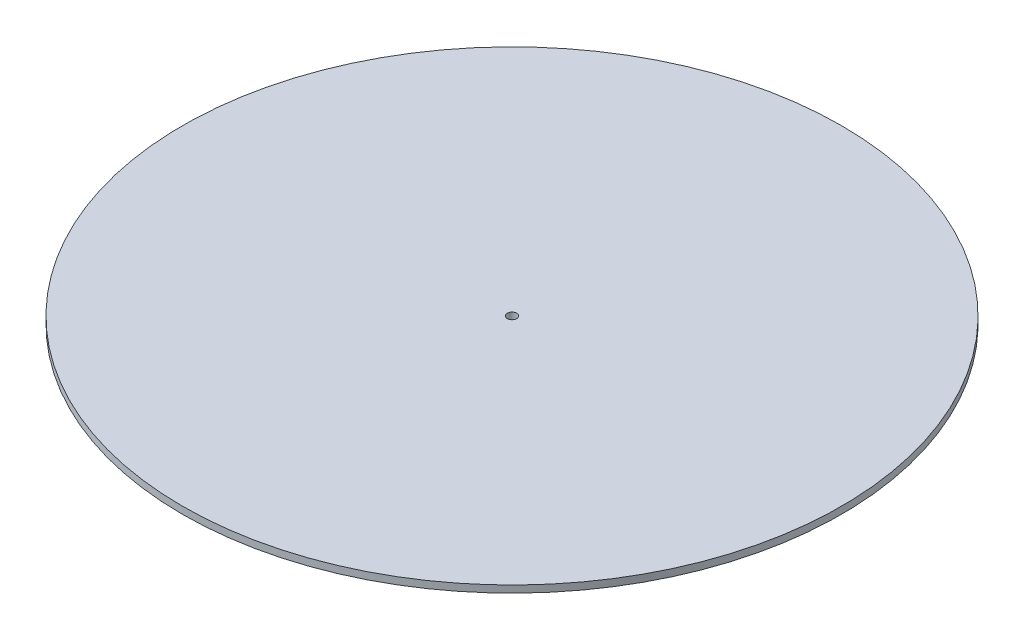
ISO-10303-21;
HEADER;
FILE_DESCRIPTION(('STEP AP214'),'2;1');
FILE_NAME('part.step','',(''),(''),'','','');
FILE_SCHEMA(('AUTOMOTIVE_DESIGN { 1 0 10303 214 1 1 1 1 }'));
ENDSEC;
DATA;
#1=APPLICATION_CONTEXT('core data for automotive mechanical design processes');
#2=APPLICATION_PROTOCOL_DEFINITION('international standard','automotive_design',2000,#1);
#3=PRODUCT_CONTEXT('',#1,'mechanical');
#4=PRODUCT('Part','Part','',(#3));
#5=PRODUCT_RELATED_PRODUCT_CATEGORY('part','',(#4));
#6=PRODUCT_DEFINITION_FORMATION('','',#4);
#7=PRODUCT_DEFINITION_CONTEXT('part definition',#1,'design');
#8=PRODUCT_DEFINITION('design','',#6,#7);
#9=PRODUCT_DEFINITION_SHAPE('','',#8);
#10=(LENGTH_UNIT() NAMED_UNIT(*) SI_UNIT(.MILLI.,.METRE.));
#11=(NAMED_UNIT(*) PLANE_ANGLE_UNIT() SI_UNIT($,.RADIAN.));
#12=(NAMED_UNIT(*) SI_UNIT($,.STERADIAN.) SOLID_ANGLE_UNIT());
#13=UNCERTAINTY_MEASURE_WITH_UNIT(LENGTH_MEASURE(1.E-05),#10,'distance_accuracy_value','');
#14=(GEOMETRIC_REPRESENTATION_CONTEXT(3) GLOBAL_UNCERTAINTY_ASSIGNED_CONTEXT((#13)) GLOBAL_UNIT_ASSIGNED_CONTEXT((#10,
#11,#12)) REPRESENTATION_CONTEXT('',''));
#15=CARTESIAN_POINT('',(0.,0.,0.));
#16=DIRECTION('',(0.,0.,1.));
#17=DIRECTION('',(1.,0.,0.));
#18=AXIS2_PLACEMENT_3D('',#15,#16,#17);
#19=CARTESIAN_POINT('',(0.,3.,0.));
#20=DIRECTION('',(0.,1.,0.));
#21=DIRECTION('',(0.,0.,1.));
#22=AXIS2_PLACEMENT_3D('',#19,#20,#21);
#23=PLANE('',#22);
#24=CARTESIAN_POINT('',(0.,3.,0.));
#25=DIRECTION('',(0.,1.,0.));
#26=DIRECTION('',(0.,0.,1.));
#27=AXIS2_PLACEMENT_3D('',#24,#25,#26);
#28=CIRCLE('',#27,140.);
#29=CARTESIAN_POINT('',(0.,3.,140.));
#30=VERTEX_POINT('',#29);
#31=EDGE_CURVE('E10',#30,#30,#28,.T.);
#32=ORIENTED_EDGE('',*,*,#31,.T.);
#33=EDGE_LOOP('',(#32));
#34=FACE_BOUND('',#33,.T.);
#35=CARTESIAN_POINT('',(0.,3.,0.));
#36=DIRECTION('',(0.,1.,0.));
#37=DIRECTION('',(0.,0.,1.));
#38=AXIS2_PLACEMENT_3D('',#35,#36,#37);
#39=CIRCLE('',#38,2.);
#40=CARTESIAN_POINT('',(0.,3.,2.));
#41=VERTEX_POINT('',#40);
#42=EDGE_CURVE('E50',#41,#41,#39,.T.);
#43=ORIENTED_EDGE('',*,*,#42,.F.);
#44=EDGE_LOOP('',(#43));
#45=FACE_BOUND('',#44,.T.);
#46=ADVANCED_FACE('F37',(#34,#45),#23,.T.);
#47=CARTESIAN_POINT('',(0.,0.,0.));
#48=DIRECTION('',(0.,1.,0.));
#49=DIRECTION('',(0.,0.,1.));
#50=AXIS2_PLACEMENT_3D('',#47,#48,#49);
#51=PLANE('',#50);
#52=CARTESIAN_POINT('',(0.,0.,0.));
#53=DIRECTION('',(0.,1.,0.));
#54=DIRECTION('',(0.,0.,1.));
#55=AXIS2_PLACEMENT_3D('',#52,#53,#54);
#56=CIRCLE('',#55,140.);
#57=CARTESIAN_POINT('',(0.,0.,140.));
#58=VERTEX_POINT('',#57);
#59=EDGE_CURVE('E41',#58,#58,#56,.T.);
#60=ORIENTED_EDGE('',*,*,#59,.F.);
#61=EDGE_LOOP('',(#60));
#62=FACE_BOUND('',#61,.T.);
#63=CARTESIAN_POINT('',(0.,0.,0.));
#64=DIRECTION('',(0.,1.,0.));
#65=DIRECTION('',(0.,0.,1.));
#66=AXIS2_PLACEMENT_3D('',#63,#64,#65);
#67=CIRCLE('',#66,2.);
#68=CARTESIAN_POINT('',(0.,0.,2.));
#69=VERTEX_POINT('',#68);
#70=EDGE_CURVE('E52',#69,#69,#67,.T.);
#71=ORIENTED_EDGE('',*,*,#70,.T.);
#72=EDGE_LOOP('',(#71));
#73=FACE_BOUND('',#72,.T.);
#74=ADVANCED_FACE('F64',(#62,#73),#51,.F.);
#75=CARTESIAN_POINT('',(0.,3.,0.));
#76=DIRECTION('',(0.,-1.,0.));
#77=DIRECTION('',(0.,0.,-1.));
#78=AXIS2_PLACEMENT_3D('',#75,#76,#77);
#79=CYLINDRICAL_SURFACE('',#78,140.);
#80=ORIENTED_EDGE('',*,*,#31,.F.);
#81=EDGE_LOOP('',(#80));
#82=FACE_BOUND('',#81,.T.);
#83=ORIENTED_EDGE('',*,*,#59,.T.);
#84=EDGE_LOOP('',(#83));
#85=FACE_BOUND('',#84,.T.);
#86=ADVANCED_FACE('F39',(#82,#85),#79,.T.);
#87=CARTESIAN_POINT('',(0.,3.,0.));
#88=DIRECTION('',(0.,-1.,0.));
#89=DIRECTION('',(0.,0.,-1.));
#90=AXIS2_PLACEMENT_3D('',#87,#88,#89);
#91=CYLINDRICAL_SURFACE('',#90,2.);
#92=ORIENTED_EDGE('',*,*,#42,.T.);
#93=EDGE_LOOP('',(#92));
#94=FACE_BOUND('',#93,.T.);
#95=ORIENTED_EDGE('',*,*,#70,.F.);
#96=EDGE_LOOP('',(#95));
#97=FACE_BOUND('',#96,.T.);
#98=ADVANCED_FACE('F60',(#94,#97),#91,.F.);
#99=CLOSED_SHELL('',(#46,#74,#86,#98));
#100=MANIFOLD_SOLID_BREP('B2',#99);
#101=ADVANCED_BREP_SHAPE_REPRESENTATION('',(#18,#100),#14);
#102=SHAPE_DEFINITION_REPRESENTATION(#9,#101);
ENDSEC;
END-ISO-10303-21;
